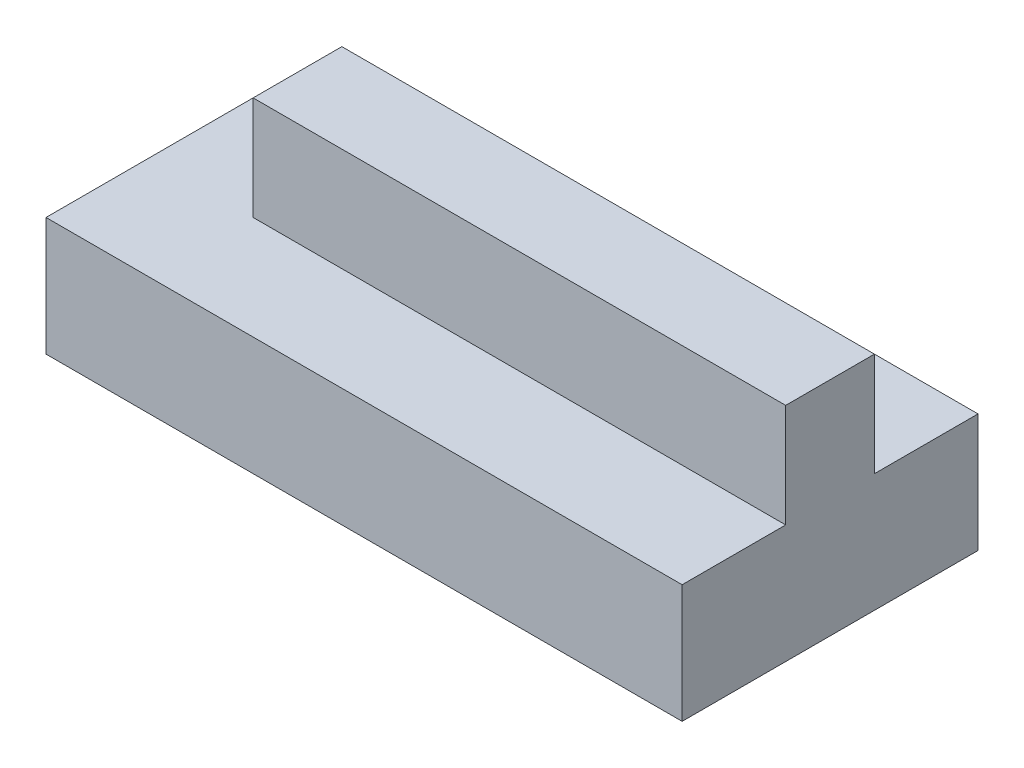
ISO-10303-21;
HEADER;
FILE_DESCRIPTION(('STEP AP214'),'2;1');
FILE_NAME('part.step','',(''),(''),'','','');
FILE_SCHEMA(('AUTOMOTIVE_DESIGN { 1 0 10303 214 1 1 1 1 }'));
ENDSEC;
DATA;
#1=APPLICATION_CONTEXT('core data for automotive mechanical design processes');
#2=APPLICATION_PROTOCOL_DEFINITION('international standard','automotive_design',2000,#1);
#3=PRODUCT_CONTEXT('',#1,'mechanical');
#4=PRODUCT('Part','Part','',(#3));
#5=PRODUCT_RELATED_PRODUCT_CATEGORY('part','',(#4));
#6=PRODUCT_DEFINITION_FORMATION('','',#4);
#7=PRODUCT_DEFINITION_CONTEXT('part definition',#1,'design');
#8=PRODUCT_DEFINITION('design','',#6,#7);
#9=PRODUCT_DEFINITION_SHAPE('','',#8);
#10=(LENGTH_UNIT() NAMED_UNIT(*) SI_UNIT(.MILLI.,.METRE.));
#11=(NAMED_UNIT(*) PLANE_ANGLE_UNIT() SI_UNIT($,.RADIAN.));
#12=(NAMED_UNIT(*) SI_UNIT($,.STERADIAN.) SOLID_ANGLE_UNIT());
#13=UNCERTAINTY_MEASURE_WITH_UNIT(LENGTH_MEASURE(1.E-05),#10,'distance_accuracy_value','');
#14=(GEOMETRIC_REPRESENTATION_CONTEXT(3) GLOBAL_UNCERTAINTY_ASSIGNED_CONTEXT((#13)) GLOBAL_UNIT_ASSIGNED_CONTEXT((#10,
#11,#12)) REPRESENTATION_CONTEXT('',''));
#15=CARTESIAN_POINT('',(0.,0.,0.));
#16=DIRECTION('',(0.,0.,1.));
#17=DIRECTION('',(1.,0.,0.));
#18=AXIS2_PLACEMENT_3D('',#15,#16,#17);
#19=CARTESIAN_POINT('',(0.,4.,0.));
#20=DIRECTION('',(0.,-1.,0.));
#21=DIRECTION('',(0.,0.,-1.));
#22=AXIS2_PLACEMENT_3D('',#19,#20,#21);
#23=PLANE('',#22);
#24=DIRECTION('',(-1.,0.,0.));
#25=VECTOR('',#24,1.);
#26=CARTESIAN_POINT('',(3.5,4.,-6.5));
#27=LINE('',#26,#25);
#28=CARTESIAN_POINT('',(21.5,4.,-6.5));
#29=VERTEX_POINT('',#28);
#30=CARTESIAN_POINT('',(3.5,4.,-6.5));
#31=VERTEX_POINT('',#30);
#32=EDGE_CURVE('E124',#29,#31,#27,.T.);
#33=ORIENTED_EDGE('',*,*,#32,.F.);
#34=DIRECTION('',(0.,0.,-1.));
#35=VECTOR('',#34,1.);
#36=CARTESIAN_POINT('',(21.5,4.,0.));
#37=LINE('',#36,#35);
#38=CARTESIAN_POINT('',(21.5,4.,-10.));
#39=VERTEX_POINT('',#38);
#40=EDGE_CURVE('E142',#29,#39,#37,.T.);
#41=ORIENTED_EDGE('',*,*,#40,.T.);
#42=DIRECTION('',(-1.,0.,0.));
#43=VECTOR('',#42,1.);
#44=CARTESIAN_POINT('',(0.,4.,-10.));
#45=LINE('',#44,#43);
#46=CARTESIAN_POINT('',(0.,4.,-10.));
#47=VERTEX_POINT('',#46);
#48=EDGE_CURVE('E145',#39,#47,#45,.T.);
#49=ORIENTED_EDGE('',*,*,#48,.T.);
#50=DIRECTION('',(0.,0.,1.));
#51=VECTOR('',#50,1.);
#52=CARTESIAN_POINT('',(0.,4.,0.));
#53=LINE('',#52,#51);
#54=CARTESIAN_POINT('',(0.,4.,0.));
#55=VERTEX_POINT('',#54);
#56=EDGE_CURVE('E136',#47,#55,#53,.T.);
#57=ORIENTED_EDGE('',*,*,#56,.T.);
#58=DIRECTION('',(1.,0.,0.));
#59=VECTOR('',#58,1.);
#60=CARTESIAN_POINT('',(0.,4.,0.));
#61=LINE('',#60,#59);
#62=CARTESIAN_POINT('',(21.5,4.,0.));
#63=VERTEX_POINT('',#62);
#64=EDGE_CURVE('E139',#55,#63,#61,.T.);
#65=ORIENTED_EDGE('',*,*,#64,.T.);
#66=CARTESIAN_POINT('',(21.5,4.,-3.5));
#67=VERTEX_POINT('',#66);
#68=EDGE_CURVE('E143',#63,#67,#37,.T.);
#69=ORIENTED_EDGE('',*,*,#68,.T.);
#70=DIRECTION('',(1.,0.,0.));
#71=VECTOR('',#70,1.);
#72=CARTESIAN_POINT('',(3.5,4.,-3.5));
#73=LINE('',#72,#71);
#74=CARTESIAN_POINT('',(3.5,4.,-3.5));
#75=VERTEX_POINT('',#74);
#76=EDGE_CURVE('E62',#75,#67,#73,.T.);
#77=ORIENTED_EDGE('',*,*,#76,.F.);
#78=DIRECTION('',(0.,0.,1.));
#79=VECTOR('',#78,1.);
#80=CARTESIAN_POINT('',(3.5,4.,-3.5));
#81=LINE('',#80,#79);
#82=EDGE_CURVE('E57',#31,#75,#81,.T.);
#83=ORIENTED_EDGE('',*,*,#82,.F.);
#84=EDGE_LOOP('',(#33,#41,#49,#57,#65,#69,#77,#83));
#85=FACE_BOUND('',#84,.T.);
#86=ADVANCED_FACE('F42',(#85),#23,.F.);
#87=CARTESIAN_POINT('',(0.,4.,0.));
#88=DIRECTION('',(1.,0.,0.));
#89=DIRECTION('',(0.,0.,-1.));
#90=AXIS2_PLACEMENT_3D('',#87,#88,#89);
#91=PLANE('',#90);
#92=DIRECTION('',(0.,0.,1.));
#93=VECTOR('',#92,1.);
#94=CARTESIAN_POINT('',(0.,0.,0.));
#95=LINE('',#94,#93);
#96=CARTESIAN_POINT('',(0.,0.,-10.));
#97=VERTEX_POINT('',#96);
#98=CARTESIAN_POINT('',(0.,0.,0.));
#99=VERTEX_POINT('',#98);
#100=EDGE_CURVE('E127',#97,#99,#95,.T.);
#101=ORIENTED_EDGE('',*,*,#100,.T.);
#102=DIRECTION('',(0.,-1.,0.));
#103=VECTOR('',#102,1.);
#104=CARTESIAN_POINT('',(0.,4.,0.));
#105=LINE('',#104,#103);
#106=EDGE_CURVE('E11',#55,#99,#105,.T.);
#107=ORIENTED_EDGE('',*,*,#106,.F.);
#108=ORIENTED_EDGE('',*,*,#56,.F.);
#109=DIRECTION('',(0.,-1.,0.));
#110=VECTOR('',#109,1.);
#111=CARTESIAN_POINT('',(0.,4.,-10.));
#112=LINE('',#111,#110);
#113=EDGE_CURVE('E146',#47,#97,#112,.T.);
#114=ORIENTED_EDGE('',*,*,#113,.T.);
#115=EDGE_LOOP('',(#101,#107,#108,#114));
#116=FACE_BOUND('',#115,.T.);
#117=ADVANCED_FACE('F44',(#116),#91,.F.);
#118=CARTESIAN_POINT('',(0.,4.,0.));
#119=DIRECTION('',(0.,0.,-1.));
#120=DIRECTION('',(-1.,0.,0.));
#121=AXIS2_PLACEMENT_3D('',#118,#119,#120);
#122=PLANE('',#121);
#123=DIRECTION('',(1.,0.,0.));
#124=VECTOR('',#123,1.);
#125=CARTESIAN_POINT('',(0.,0.,0.));
#126=LINE('',#125,#124);
#127=CARTESIAN_POINT('',(21.5,0.,0.));
#128=VERTEX_POINT('',#127);
#129=EDGE_CURVE('E130',#99,#128,#126,.T.);
#130=ORIENTED_EDGE('',*,*,#129,.T.);
#131=DIRECTION('',(0.,-1.,0.));
#132=VECTOR('',#131,1.);
#133=CARTESIAN_POINT('',(21.5,4.,0.));
#134=LINE('',#133,#132);
#135=EDGE_CURVE('E50',#63,#128,#134,.T.);
#136=ORIENTED_EDGE('',*,*,#135,.F.);
#137=ORIENTED_EDGE('',*,*,#64,.F.);
#138=ORIENTED_EDGE('',*,*,#106,.T.);
#139=EDGE_LOOP('',(#130,#136,#137,#138));
#140=FACE_BOUND('',#139,.T.);
#141=ADVANCED_FACE('F202',(#140),#122,.F.);
#142=CARTESIAN_POINT('',(21.5,4.,0.));
#143=DIRECTION('',(-1.,0.,0.));
#144=DIRECTION('',(0.,0.,1.));
#145=AXIS2_PLACEMENT_3D('',#142,#143,#144);
#146=PLANE('',#145);
#147=DIRECTION('',(0.,0.,-1.));
#148=VECTOR('',#147,1.);
#149=CARTESIAN_POINT('',(21.5,0.,0.));
#150=LINE('',#149,#148);
#151=CARTESIAN_POINT('',(21.5,0.,-10.));
#152=VERTEX_POINT('',#151);
#153=EDGE_CURVE('E149',#128,#152,#150,.T.);
#154=ORIENTED_EDGE('',*,*,#153,.T.);
#155=DIRECTION('',(0.,-1.,0.));
#156=VECTOR('',#155,1.);
#157=CARTESIAN_POINT('',(21.5,4.,-10.));
#158=LINE('',#157,#156);
#159=EDGE_CURVE('E154',#39,#152,#158,.T.);
#160=ORIENTED_EDGE('',*,*,#159,.F.);
#161=ORIENTED_EDGE('',*,*,#40,.F.);
#162=DIRECTION('',(0.,-1.,0.));
#163=VECTOR('',#162,1.);
#164=CARTESIAN_POINT('',(21.5,7.5,-6.5));
#165=LINE('',#164,#163);
#166=CARTESIAN_POINT('',(21.5,7.5,-6.5));
#167=VERTEX_POINT('',#166);
#168=EDGE_CURVE('E132',#167,#29,#165,.T.);
#169=ORIENTED_EDGE('',*,*,#168,.F.);
#170=DIRECTION('',(0.,0.,-1.));
#171=VECTOR('',#170,1.);
#172=CARTESIAN_POINT('',(21.5,7.5,-3.5));
#173=LINE('',#172,#171);
#174=CARTESIAN_POINT('',(21.5,7.5,-3.5));
#175=VERTEX_POINT('',#174);
#176=EDGE_CURVE('E114',#175,#167,#173,.T.);
#177=ORIENTED_EDGE('',*,*,#176,.F.);
#178=DIRECTION('',(0.,-1.,0.));
#179=VECTOR('',#178,1.);
#180=CARTESIAN_POINT('',(21.5,7.5,-3.5));
#181=LINE('',#180,#179);
#182=EDGE_CURVE('E111',#175,#67,#181,.T.);
#183=ORIENTED_EDGE('',*,*,#182,.T.);
#184=ORIENTED_EDGE('',*,*,#68,.F.);
#185=ORIENTED_EDGE('',*,*,#135,.T.);
#186=EDGE_LOOP('',(#154,#160,#161,#169,#177,#183,#184,#185));
#187=FACE_BOUND('',#186,.T.);
#188=ADVANCED_FACE('F161',(#187),#146,.F.);
#189=CARTESIAN_POINT('',(0.,4.,-10.));
#190=DIRECTION('',(0.,0.,1.));
#191=DIRECTION('',(1.,0.,0.));
#192=AXIS2_PLACEMENT_3D('',#189,#190,#191);
#193=PLANE('',#192);
#194=DIRECTION('',(-1.,0.,0.));
#195=VECTOR('',#194,1.);
#196=CARTESIAN_POINT('',(0.,0.,-10.));
#197=LINE('',#196,#195);
#198=EDGE_CURVE('E140',#152,#97,#197,.T.);
#199=ORIENTED_EDGE('',*,*,#198,.T.);
#200=ORIENTED_EDGE('',*,*,#113,.F.);
#201=ORIENTED_EDGE('',*,*,#48,.F.);
#202=ORIENTED_EDGE('',*,*,#159,.T.);
#203=EDGE_LOOP('',(#199,#200,#201,#202));
#204=FACE_BOUND('',#203,.T.);
#205=ADVANCED_FACE('F170',(#204),#193,.F.);
#206=CARTESIAN_POINT('',(0.,0.,0.));
#207=DIRECTION('',(0.,-1.,0.));
#208=DIRECTION('',(0.,0.,-1.));
#209=AXIS2_PLACEMENT_3D('',#206,#207,#208);
#210=PLANE('',#209);
#211=ORIENTED_EDGE('',*,*,#100,.F.);
#212=ORIENTED_EDGE('',*,*,#198,.F.);
#213=ORIENTED_EDGE('',*,*,#153,.F.);
#214=ORIENTED_EDGE('',*,*,#129,.F.);
#215=EDGE_LOOP('',(#211,#212,#213,#214));
#216=FACE_BOUND('',#215,.T.);
#217=ADVANCED_FACE('F167',(#216),#210,.T.);
#218=CARTESIAN_POINT('',(3.5,7.5,-3.5));
#219=DIRECTION('',(1.,0.,0.));
#220=DIRECTION('',(0.,0.,-1.));
#221=AXIS2_PLACEMENT_3D('',#218,#219,#220);
#222=PLANE('',#221);
#223=ORIENTED_EDGE('',*,*,#82,.T.);
#224=DIRECTION('',(0.,-1.,0.));
#225=VECTOR('',#224,1.);
#226=CARTESIAN_POINT('',(3.5,7.5,-3.5));
#227=LINE('',#226,#225);
#228=CARTESIAN_POINT('',(3.5,7.5,-3.5));
#229=VERTEX_POINT('',#228);
#230=EDGE_CURVE('E109',#229,#75,#227,.T.);
#231=ORIENTED_EDGE('',*,*,#230,.F.);
#232=DIRECTION('',(0.,0.,1.));
#233=VECTOR('',#232,1.);
#234=CARTESIAN_POINT('',(3.5,7.5,-3.5));
#235=LINE('',#234,#233);
#236=CARTESIAN_POINT('',(3.5,7.5,-6.5));
#237=VERTEX_POINT('',#236);
#238=EDGE_CURVE('E115',#237,#229,#235,.T.);
#239=ORIENTED_EDGE('',*,*,#238,.F.);
#240=DIRECTION('',(0.,-1.,0.));
#241=VECTOR('',#240,1.);
#242=CARTESIAN_POINT('',(3.5,7.5,-6.5));
#243=LINE('',#242,#241);
#244=EDGE_CURVE('E180',#237,#31,#243,.T.);
#245=ORIENTED_EDGE('',*,*,#244,.T.);
#246=EDGE_LOOP('',(#223,#231,#239,#245));
#247=FACE_BOUND('',#246,.T.);
#248=ADVANCED_FACE('F126',(#247),#222,.F.);
#249=CARTESIAN_POINT('',(3.5,7.5,-3.5));
#250=DIRECTION('',(0.,0.,-1.));
#251=DIRECTION('',(-1.,0.,0.));
#252=AXIS2_PLACEMENT_3D('',#249,#250,#251);
#253=PLANE('',#252);
#254=ORIENTED_EDGE('',*,*,#76,.T.);
#255=ORIENTED_EDGE('',*,*,#182,.F.);
#256=DIRECTION('',(1.,0.,0.));
#257=VECTOR('',#256,1.);
#258=CARTESIAN_POINT('',(3.5,7.5,-3.5));
#259=LINE('',#258,#257);
#260=EDGE_CURVE('E105',#229,#175,#259,.T.);
#261=ORIENTED_EDGE('',*,*,#260,.F.);
#262=ORIENTED_EDGE('',*,*,#230,.T.);
#263=EDGE_LOOP('',(#254,#255,#261,#262));
#264=FACE_BOUND('',#263,.T.);
#265=ADVANCED_FACE('F107',(#264),#253,.F.);
#266=CARTESIAN_POINT('',(3.5,7.5,-6.5));
#267=DIRECTION('',(0.,0.,1.));
#268=DIRECTION('',(1.,0.,0.));
#269=AXIS2_PLACEMENT_3D('',#266,#267,#268);
#270=PLANE('',#269);
#271=ORIENTED_EDGE('',*,*,#32,.T.);
#272=ORIENTED_EDGE('',*,*,#244,.F.);
#273=DIRECTION('',(-1.,0.,0.));
#274=VECTOR('',#273,1.);
#275=CARTESIAN_POINT('',(3.5,7.5,-6.5));
#276=LINE('',#275,#274);
#277=EDGE_CURVE('E120',#167,#237,#276,.T.);
#278=ORIENTED_EDGE('',*,*,#277,.F.);
#279=ORIENTED_EDGE('',*,*,#168,.T.);
#280=EDGE_LOOP('',(#271,#272,#278,#279));
#281=FACE_BOUND('',#280,.T.);
#282=ADVANCED_FACE('F179',(#281),#270,.F.);
#283=CARTESIAN_POINT('',(0.,7.5,0.));
#284=DIRECTION('',(0.,-1.,0.));
#285=DIRECTION('',(0.,0.,-1.));
#286=AXIS2_PLACEMENT_3D('',#283,#284,#285);
#287=PLANE('',#286);
#288=ORIENTED_EDGE('',*,*,#238,.T.);
#289=ORIENTED_EDGE('',*,*,#260,.T.);
#290=ORIENTED_EDGE('',*,*,#176,.T.);
#291=ORIENTED_EDGE('',*,*,#277,.T.);
#292=EDGE_LOOP('',(#288,#289,#290,#291));
#293=FACE_BOUND('',#292,.T.);
#294=ADVANCED_FACE('F118',(#293),#287,.F.);
#295=CLOSED_SHELL('',(#86,#117,#141,#188,#205,#217,#248,#265,#282,#294));
#296=MANIFOLD_SOLID_BREP('B2',#295);
#297=ADVANCED_BREP_SHAPE_REPRESENTATION('',(#18,#296),#14);
#298=SHAPE_DEFINITION_REPRESENTATION(#9,#297);
ENDSEC;
END-ISO-10303-21;
